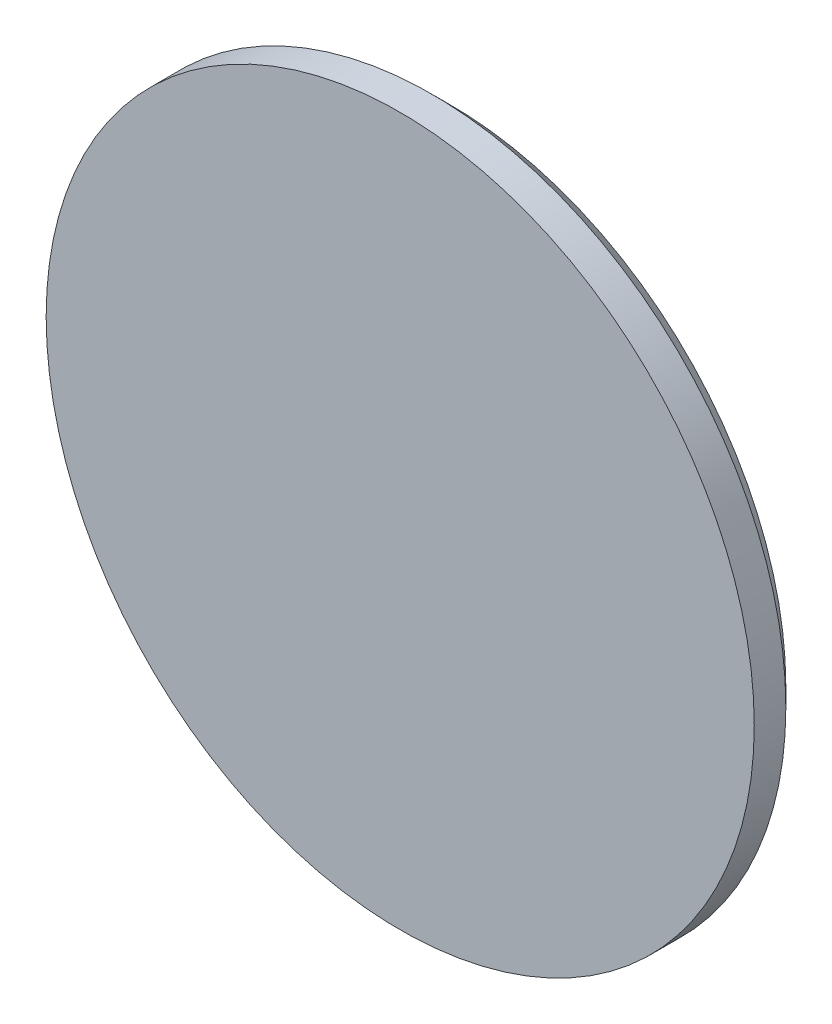
ISO-10303-21;
HEADER;
FILE_DESCRIPTION(('STEP AP214'),'2;1');
FILE_NAME('part.step','',(''),(''),'','','');
FILE_SCHEMA(('AUTOMOTIVE_DESIGN { 1 0 10303 214 1 1 1 1 }'));
ENDSEC;
DATA;
#1=APPLICATION_CONTEXT('core data for automotive mechanical design processes');
#2=APPLICATION_PROTOCOL_DEFINITION('international standard','automotive_design',2000,#1);
#3=PRODUCT_CONTEXT('',#1,'mechanical');
#4=PRODUCT('Part','Part','',(#3));
#5=PRODUCT_RELATED_PRODUCT_CATEGORY('part','',(#4));
#6=PRODUCT_DEFINITION_FORMATION('','',#4);
#7=PRODUCT_DEFINITION_CONTEXT('part definition',#1,'design');
#8=PRODUCT_DEFINITION('design','',#6,#7);
#9=PRODUCT_DEFINITION_SHAPE('','',#8);
#10=(LENGTH_UNIT() NAMED_UNIT(*) SI_UNIT(.MILLI.,.METRE.));
#11=(NAMED_UNIT(*) PLANE_ANGLE_UNIT() SI_UNIT($,.RADIAN.));
#12=(NAMED_UNIT(*) SI_UNIT($,.STERADIAN.) SOLID_ANGLE_UNIT());
#13=UNCERTAINTY_MEASURE_WITH_UNIT(LENGTH_MEASURE(1.E-05),#10,'distance_accuracy_value','');
#14=(GEOMETRIC_REPRESENTATION_CONTEXT(3) GLOBAL_UNCERTAINTY_ASSIGNED_CONTEXT((#13)) GLOBAL_UNIT_ASSIGNED_CONTEXT((#10,
#11,#12)) REPRESENTATION_CONTEXT('',''));
#15=CARTESIAN_POINT('',(0.,0.,0.));
#16=DIRECTION('',(0.,0.,1.));
#17=DIRECTION('',(1.,0.,0.));
#18=AXIS2_PLACEMENT_3D('',#15,#16,#17);
#19=CARTESIAN_POINT('',(-33.2031579230997,22.4394968381388,3.5));
#20=DIRECTION('',(0.,0.,-1.));
#21=DIRECTION('',(-1.,0.,0.));
#22=AXIS2_PLACEMENT_3D('',#19,#20,#21);
#23=CYLINDRICAL_SURFACE('',#22,25.);
#24=CARTESIAN_POINT('',(-33.2031579230997,22.4394968381388,1.27));
#25=DIRECTION('',(0.,0.,1.));
#26=DIRECTION('',(1.,0.,0.));
#27=AXIS2_PLACEMENT_3D('',#24,#25,#26);
#28=CIRCLE('',#27,25.);
#29=CARTESIAN_POINT('',(-8.20315792309975,22.4394968381388,1.27));
#30=VERTEX_POINT('',#29);
#31=EDGE_CURVE('E46',#30,#30,#28,.T.);
#32=ORIENTED_EDGE('',*,*,#31,.T.);
#33=EDGE_LOOP('',(#32));
#34=FACE_BOUND('',#33,.T.);
#35=CARTESIAN_POINT('',(-33.2031579230997,22.4394968381388,3.5));
#36=DIRECTION('',(0.,0.,1.));
#37=DIRECTION('',(1.,0.,0.));
#38=AXIS2_PLACEMENT_3D('',#35,#36,#37);
#39=CIRCLE('',#38,25.);
#40=CARTESIAN_POINT('',(-8.20315792309975,22.4394968381388,3.5));
#41=VERTEX_POINT('',#40);
#42=EDGE_CURVE('E50',#41,#41,#39,.T.);
#43=ORIENTED_EDGE('',*,*,#42,.F.);
#44=EDGE_LOOP('',(#43));
#45=FACE_BOUND('',#44,.T.);
#46=ADVANCED_FACE('F38',(#34,#45),#23,.T.);
#47=CARTESIAN_POINT('',(-33.2031579230997,22.4394968381388,3.5));
#48=DIRECTION('',(0.,0.,1.));
#49=DIRECTION('',(1.,0.,0.));
#50=AXIS2_PLACEMENT_3D('',#47,#48,#49);
#51=PLANE('',#50);
#52=ORIENTED_EDGE('',*,*,#42,.T.);
#53=EDGE_LOOP('',(#52));
#54=FACE_BOUND('',#53,.T.);
#55=ADVANCED_FACE('F57',(#54),#51,.T.);
#56=CARTESIAN_POINT('',(-33.2031579230997,22.4394968381388,0.));
#57=DIRECTION('',(0.,0.,1.));
#58=DIRECTION('',(1.,0.,0.));
#59=AXIS2_PLACEMENT_3D('',#56,#57,#58);
#60=PLANE('',#59);
#61=CARTESIAN_POINT('',(-33.2031579230997,22.4394968381388,0.));
#62=DIRECTION('',(0.,0.,1.));
#63=DIRECTION('',(1.,0.,0.));
#64=AXIS2_PLACEMENT_3D('',#61,#62,#63);
#65=CIRCLE('',#64,23.73);
#66=CARTESIAN_POINT('',(-9.47315792309974,22.4394968381388,0.));
#67=VERTEX_POINT('',#66);
#68=EDGE_CURVE('E10',#67,#67,#65,.F.);
#69=ORIENTED_EDGE('',*,*,#68,.T.);
#70=EDGE_LOOP('',(#69));
#71=FACE_BOUND('',#70,.T.);
#72=ADVANCED_FACE('F63',(#71),#60,.F.);
#73=CARTESIAN_POINT('',(-33.2031579230997,22.4394968381388,1.27));
#74=DIRECTION('',(0.,0.,1.));
#75=DIRECTION('',(1.,0.,0.));
#76=AXIS2_PLACEMENT_3D('',#73,#74,#75);
#77=CONICAL_SURFACE('',#76,25.,0.78539816339745);
#78=ORIENTED_EDGE('',*,*,#68,.F.);
#79=EDGE_LOOP('',(#78));
#80=FACE_BOUND('',#79,.T.);
#81=ORIENTED_EDGE('',*,*,#31,.F.);
#82=EDGE_LOOP('',(#81));
#83=FACE_BOUND('',#82,.T.);
#84=ADVANCED_FACE('F41',(#80,#83),#77,.T.);
#85=CLOSED_SHELL('',(#46,#55,#72,#84));
#86=MANIFOLD_SOLID_BREP('B2',#85);
#87=ADVANCED_BREP_SHAPE_REPRESENTATION('',(#18,#86),#14);
#88=SHAPE_DEFINITION_REPRESENTATION(#9,#87);
ENDSEC;
END-ISO-10303-21;
